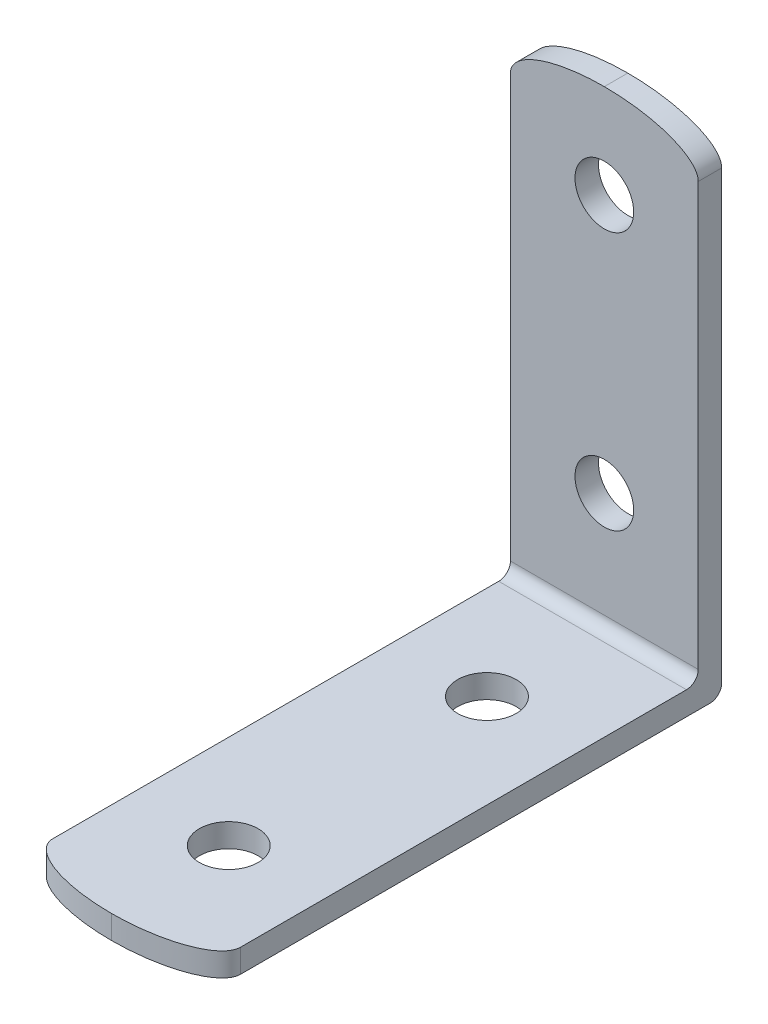
ISO-10303-21;
HEADER;
FILE_DESCRIPTION(('STEP AP214'),'2;1');
FILE_NAME('part.step','',(''),(''),'','','');
FILE_SCHEMA(('AUTOMOTIVE_DESIGN { 1 0 10303 214 1 1 1 1 }'));
ENDSEC;
DATA;
#1=APPLICATION_CONTEXT('core data for automotive mechanical design processes');
#2=APPLICATION_PROTOCOL_DEFINITION('international standard','automotive_design',2000,#1);
#3=PRODUCT_CONTEXT('',#1,'mechanical');
#4=PRODUCT('Part','Part','',(#3));
#5=PRODUCT_RELATED_PRODUCT_CATEGORY('part','',(#4));
#6=PRODUCT_DEFINITION_FORMATION('','',#4);
#7=PRODUCT_DEFINITION_CONTEXT('part definition',#1,'design');
#8=PRODUCT_DEFINITION('design','',#6,#7);
#9=PRODUCT_DEFINITION_SHAPE('','',#8);
#10=(LENGTH_UNIT() NAMED_UNIT(*) SI_UNIT(.MILLI.,.METRE.));
#11=(NAMED_UNIT(*) PLANE_ANGLE_UNIT() SI_UNIT($,.RADIAN.));
#12=(NAMED_UNIT(*) SI_UNIT($,.STERADIAN.) SOLID_ANGLE_UNIT());
#13=UNCERTAINTY_MEASURE_WITH_UNIT(LENGTH_MEASURE(1.E-05),#10,'distance_accuracy_value','');
#14=(GEOMETRIC_REPRESENTATION_CONTEXT(3) GLOBAL_UNCERTAINTY_ASSIGNED_CONTEXT((#13)) GLOBAL_UNIT_ASSIGNED_CONTEXT((#10,
#11,#12)) REPRESENTATION_CONTEXT('',''));
#15=CARTESIAN_POINT('',(0.,0.,0.));
#16=DIRECTION('',(0.,0.,1.));
#17=DIRECTION('',(1.,0.,0.));
#18=AXIS2_PLACEMENT_3D('',#15,#16,#17);
#19=CARTESIAN_POINT('',(0.,0.,2.));
#20=DIRECTION('',(0.,0.,1.));
#21=DIRECTION('',(1.,0.,0.));
#22=AXIS2_PLACEMENT_3D('',#19,#20,#21);
#23=PLANE('',#22);
#24=CARTESIAN_POINT('',(0.,12.,2.));
#25=DIRECTION('',(0.,0.,1.));
#26=DIRECTION('',(1.,0.,0.));
#27=AXIS2_PLACEMENT_3D('',#24,#25,#26);
#28=CIRCLE('',#27,2.5);
#29=CARTESIAN_POINT('',(2.5,12.,2.));
#30=VERTEX_POINT('',#29);
#31=EDGE_CURVE('E181',#30,#30,#28,.T.);
#32=ORIENTED_EDGE('',*,*,#31,.F.);
#33=EDGE_LOOP('',(#32));
#34=FACE_BOUND('',#33,.T.);
#35=CARTESIAN_POINT('',(0.,34.,2.));
#36=DIRECTION('',(0.,0.,1.));
#37=DIRECTION('',(1.,0.,0.));
#38=AXIS2_PLACEMENT_3D('',#35,#36,#37);
#39=CIRCLE('',#38,2.5);
#40=CARTESIAN_POINT('',(2.5,34.,2.));
#41=VERTEX_POINT('',#40);
#42=EDGE_CURVE('E556',#41,#41,#39,.T.);
#43=ORIENTED_EDGE('',*,*,#42,.F.);
#44=EDGE_LOOP('',(#43));
#45=FACE_BOUND('',#44,.T.);
#46=CARTESIAN_POINT('',(0.,42.,2.));
#47=CARTESIAN_POINT('',(8.,42.,2.));
#48=CARTESIAN_POINT('',(8.,39.,2.));
#49=(BOUNDED_CURVE() B_SPLINE_CURVE(2,(#46,#47,#48),.UNSPECIFIED.,.F.,
.F.) B_SPLINE_CURVE_WITH_KNOTS((3,3),(0.,1.),
.UNSPECIFIED.) CURVE() GEOMETRIC_REPRESENTATION_ITEM() RATIONAL_B_SPLINE_CURVE((1.,
0.707106781186548,1.)) REPRESENTATION_ITEM(''));
#50=CARTESIAN_POINT('',(8.,39.,2.));
#51=VERTEX_POINT('',#50);
#52=CARTESIAN_POINT('',(0.,42.,2.));
#53=VERTEX_POINT('',#52);
#54=EDGE_CURVE('E470',#51,#53,#49,.F.);
#55=ORIENTED_EDGE('',*,*,#54,.T.);
#56=CARTESIAN_POINT('',(-8.00000000000001,39.,2.));
#57=CARTESIAN_POINT('',(-8.00000000000001,42.,2.));
#58=CARTESIAN_POINT('',(0.,42.,2.));
#59=(BOUNDED_CURVE() B_SPLINE_CURVE(2,(#56,#57,#58),.UNSPECIFIED.,.F.,
.F.) B_SPLINE_CURVE_WITH_KNOTS((3,3),(0.,1.),
.UNSPECIFIED.) CURVE() GEOMETRIC_REPRESENTATION_ITEM() RATIONAL_B_SPLINE_CURVE((1.,
0.707106781186548,1.)) REPRESENTATION_ITEM(''));
#60=CARTESIAN_POINT('',(-8.00000000000001,39.,2.));
#61=VERTEX_POINT('',#60);
#62=EDGE_CURVE('E13',#53,#61,#59,.F.);
#63=ORIENTED_EDGE('',*,*,#62,.T.);
#64=DIRECTION('',(0.,-1.,0.));
#65=VECTOR('',#64,1.);
#66=CARTESIAN_POINT('',(-8.00000000000001,42.,2.));
#67=LINE('',#66,#65);
#68=CARTESIAN_POINT('',(-8.,3.00000000000001,2.));
#69=VERTEX_POINT('',#68);
#70=EDGE_CURVE('E131',#61,#69,#67,.T.);
#71=ORIENTED_EDGE('',*,*,#70,.T.);
#72=DIRECTION('',(1.,0.,0.));
#73=VECTOR('',#72,1.);
#74=CARTESIAN_POINT('',(8.,3.,2.));
#75=LINE('',#74,#73);
#76=CARTESIAN_POINT('',(8.,3.,2.));
#77=VERTEX_POINT('',#76);
#78=EDGE_CURVE('E135',#69,#77,#75,.T.);
#79=ORIENTED_EDGE('',*,*,#78,.T.);
#80=DIRECTION('',(0.,1.,0.));
#81=VECTOR('',#80,1.);
#82=CARTESIAN_POINT('',(8.,0.,2.));
#83=LINE('',#82,#81);
#84=EDGE_CURVE('E139',#77,#51,#83,.T.);
#85=ORIENTED_EDGE('',*,*,#84,.T.);
#86=EDGE_LOOP('',(#55,#63,#71,#79,#85));
#87=FACE_BOUND('',#86,.T.);
#88=ADVANCED_FACE('F50',(#34,#45,#87),#23,.T.);
#89=CARTESIAN_POINT('',(0.,0.,0.));
#90=DIRECTION('',(0.,0.,1.));
#91=DIRECTION('',(1.,0.,0.));
#92=AXIS2_PLACEMENT_3D('',#89,#90,#91);
#93=PLANE('',#92);
#94=DIRECTION('',(0.,-1.,0.));
#95=VECTOR('',#94,1.);
#96=CARTESIAN_POINT('',(-8.00000000000001,42.,0.));
#97=LINE('',#96,#95);
#98=CARTESIAN_POINT('',(-8.00000000000001,39.,0.));
#99=VERTEX_POINT('',#98);
#100=CARTESIAN_POINT('',(-8.,1.00000000000001,0.));
#101=VERTEX_POINT('',#100);
#102=EDGE_CURVE('E180',#99,#101,#97,.T.);
#103=ORIENTED_EDGE('',*,*,#102,.F.);
#104=CARTESIAN_POINT('',(0.,42.,0.));
#105=CARTESIAN_POINT('',(-8.00000000000001,42.,0.));
#106=CARTESIAN_POINT('',(-8.00000000000001,39.,0.));
#107=(BOUNDED_CURVE() B_SPLINE_CURVE(2,(#104,#105,#106),.UNSPECIFIED.,.F.,
.F.) B_SPLINE_CURVE_WITH_KNOTS((3,3),(0.,1.),
.UNSPECIFIED.) CURVE() GEOMETRIC_REPRESENTATION_ITEM() RATIONAL_B_SPLINE_CURVE((1.,
0.707106781186548,1.)) REPRESENTATION_ITEM(''));
#108=CARTESIAN_POINT('',(0.,42.,0.));
#109=VERTEX_POINT('',#108);
#110=EDGE_CURVE('E64',#99,#109,#107,.F.);
#111=ORIENTED_EDGE('',*,*,#110,.T.);
#112=CARTESIAN_POINT('',(8.,39.,0.));
#113=CARTESIAN_POINT('',(8.,42.,0.));
#114=CARTESIAN_POINT('',(0.,42.,0.));
#115=(BOUNDED_CURVE() B_SPLINE_CURVE(2,(#112,#113,#114),.UNSPECIFIED.,.F.,
.F.) B_SPLINE_CURVE_WITH_KNOTS((3,3),(0.,1.),
.UNSPECIFIED.) CURVE() GEOMETRIC_REPRESENTATION_ITEM() RATIONAL_B_SPLINE_CURVE((1.,
0.707106781186548,1.)) REPRESENTATION_ITEM(''));
#116=CARTESIAN_POINT('',(8.,39.,0.));
#117=VERTEX_POINT('',#116);
#118=EDGE_CURVE('E268',#109,#117,#115,.F.);
#119=ORIENTED_EDGE('',*,*,#118,.T.);
#120=DIRECTION('',(0.,1.,0.));
#121=VECTOR('',#120,1.);
#122=CARTESIAN_POINT('',(8.,0.,0.));
#123=LINE('',#122,#121);
#124=CARTESIAN_POINT('',(8.,1.,0.));
#125=VERTEX_POINT('',#124);
#126=EDGE_CURVE('E176',#125,#117,#123,.T.);
#127=ORIENTED_EDGE('',*,*,#126,.F.);
#128=DIRECTION('',(1.,0.,0.));
#129=VECTOR('',#128,1.);
#130=CARTESIAN_POINT('',(0.,1.,0.));
#131=LINE('',#130,#129);
#132=EDGE_CURVE('E169',#125,#101,#131,.F.);
#133=ORIENTED_EDGE('',*,*,#132,.T.);
#134=EDGE_LOOP('',(#103,#111,#119,#127,#133));
#135=FACE_BOUND('',#134,.T.);
#136=CARTESIAN_POINT('',(0.,12.,0.));
#137=DIRECTION('',(0.,0.,1.));
#138=DIRECTION('',(1.,0.,0.));
#139=AXIS2_PLACEMENT_3D('',#136,#137,#138);
#140=CIRCLE('',#139,2.5);
#141=CARTESIAN_POINT('',(2.5,12.,0.));
#142=VERTEX_POINT('',#141);
#143=EDGE_CURVE('E559',#142,#142,#140,.T.);
#144=ORIENTED_EDGE('',*,*,#143,.T.);
#145=EDGE_LOOP('',(#144));
#146=FACE_BOUND('',#145,.T.);
#147=CARTESIAN_POINT('',(0.,34.,0.));
#148=DIRECTION('',(0.,0.,1.));
#149=DIRECTION('',(1.,0.,0.));
#150=AXIS2_PLACEMENT_3D('',#147,#148,#149);
#151=CIRCLE('',#150,2.5);
#152=CARTESIAN_POINT('',(2.5,34.,0.));
#153=VERTEX_POINT('',#152);
#154=EDGE_CURVE('E549',#153,#153,#151,.T.);
#155=ORIENTED_EDGE('',*,*,#154,.T.);
#156=EDGE_LOOP('',(#155));
#157=FACE_BOUND('',#156,.T.);
#158=ADVANCED_FACE('F212',(#135,#146,#157),#93,.F.);
#159=CARTESIAN_POINT('',(0.,0.,2.));
#160=DIRECTION('',(0.,1.,0.));
#161=DIRECTION('',(0.,0.,1.));
#162=AXIS2_PLACEMENT_3D('',#159,#160,#161);
#163=PLANE('',#162);
#164=CARTESIAN_POINT('',(0.,0.,12.));
#165=DIRECTION('',(0.,-1.,0.));
#166=DIRECTION('',(0.,0.,-1.));
#167=AXIS2_PLACEMENT_3D('',#164,#165,#166);
#168=CIRCLE('',#167,2.5);
#169=CARTESIAN_POINT('',(0.,0.,9.5));
#170=VERTEX_POINT('',#169);
#171=EDGE_CURVE('E568',#170,#170,#168,.T.);
#172=ORIENTED_EDGE('',*,*,#171,.F.);
#173=EDGE_LOOP('',(#172));
#174=FACE_BOUND('',#173,.T.);
#175=CARTESIAN_POINT('',(0.,0.,34.));
#176=DIRECTION('',(0.,-1.,0.));
#177=DIRECTION('',(0.,0.,-1.));
#178=AXIS2_PLACEMENT_3D('',#175,#176,#177);
#179=CIRCLE('',#178,2.5);
#180=CARTESIAN_POINT('',(0.,0.,31.5));
#181=VERTEX_POINT('',#180);
#182=EDGE_CURVE('E590',#181,#181,#179,.T.);
#183=ORIENTED_EDGE('',*,*,#182,.F.);
#184=EDGE_LOOP('',(#183));
#185=FACE_BOUND('',#184,.T.);
#186=CARTESIAN_POINT('',(0.,0.,44.));
#187=CARTESIAN_POINT('',(8.,0.,44.));
#188=CARTESIAN_POINT('',(8.,0.,41.));
#189=(BOUNDED_CURVE() B_SPLINE_CURVE(2,(#186,#187,#188),.UNSPECIFIED.,.F.,
.F.) B_SPLINE_CURVE_WITH_KNOTS((3,3),(0.,1.),
.UNSPECIFIED.) CURVE() GEOMETRIC_REPRESENTATION_ITEM() RATIONAL_B_SPLINE_CURVE((1.,
0.707106781186548,1.)) REPRESENTATION_ITEM(''));
#190=CARTESIAN_POINT('',(8.,0.,41.));
#191=VERTEX_POINT('',#190);
#192=CARTESIAN_POINT('',(0.,0.,44.));
#193=VERTEX_POINT('',#192);
#194=EDGE_CURVE('E467',#191,#193,#189,.F.);
#195=ORIENTED_EDGE('',*,*,#194,.T.);
#196=CARTESIAN_POINT('',(-8.,0.,41.));
#197=CARTESIAN_POINT('',(-8.,0.,44.));
#198=CARTESIAN_POINT('',(0.,0.,44.));
#199=(BOUNDED_CURVE() B_SPLINE_CURVE(2,(#196,#197,#198),.UNSPECIFIED.,.F.,
.F.) B_SPLINE_CURVE_WITH_KNOTS((3,3),(0.,1.),
.UNSPECIFIED.) CURVE() GEOMETRIC_REPRESENTATION_ITEM() RATIONAL_B_SPLINE_CURVE((1.,
0.707106781186548,1.)) REPRESENTATION_ITEM(''));
#200=CARTESIAN_POINT('',(-8.,0.,41.));
#201=VERTEX_POINT('',#200);
#202=EDGE_CURVE('E335',#193,#201,#199,.F.);
#203=ORIENTED_EDGE('',*,*,#202,.T.);
#204=DIRECTION('',(0.,0.,-1.));
#205=VECTOR('',#204,1.);
#206=CARTESIAN_POINT('',(-8.,0.,2.));
#207=LINE('',#206,#205);
#208=CARTESIAN_POINT('',(-8.,0.,1.));
#209=VERTEX_POINT('',#208);
#210=EDGE_CURVE('E138',#201,#209,#207,.T.);
#211=ORIENTED_EDGE('',*,*,#210,.T.);
#212=DIRECTION('',(1.,0.,0.));
#213=VECTOR('',#212,1.);
#214=CARTESIAN_POINT('',(0.,0.,1.));
#215=LINE('',#214,#213);
#216=CARTESIAN_POINT('',(8.,0.,1.));
#217=VERTEX_POINT('',#216);
#218=EDGE_CURVE('E158',#209,#217,#215,.T.);
#219=ORIENTED_EDGE('',*,*,#218,.T.);
#220=DIRECTION('',(0.,0.,-1.));
#221=VECTOR('',#220,1.);
#222=CARTESIAN_POINT('',(8.,0.,2.));
#223=LINE('',#222,#221);
#224=EDGE_CURVE('E156',#191,#217,#223,.T.);
#225=ORIENTED_EDGE('',*,*,#224,.F.);
#226=EDGE_LOOP('',(#195,#203,#211,#219,#225));
#227=FACE_BOUND('',#226,.T.);
#228=ADVANCED_FACE('F531',(#174,#185,#227),#163,.F.);
#229=CARTESIAN_POINT('',(8.,0.,2.));
#230=DIRECTION('',(-1.,0.,0.));
#231=DIRECTION('',(0.,0.,1.));
#232=AXIS2_PLACEMENT_3D('',#229,#230,#231);
#233=PLANE('',#232);
#234=ORIENTED_EDGE('',*,*,#126,.T.);
#235=CARTESIAN_POINT('',(8.,39.,2.1));
#236=CARTESIAN_POINT('',(8.,39.,1.36666666666667));
#237=CARTESIAN_POINT('',(8.,39.,0.633333333333333));
#238=CARTESIAN_POINT('',(8.,39.,-0.1));
#239=(BOUNDED_CURVE() B_SPLINE_CURVE(3,(#235,#236,#237,#238),.UNSPECIFIED.,.F.,
.F.) B_SPLINE_CURVE_WITH_KNOTS((4,4),(-0.0001,0.0021),
.UNSPECIFIED.) CURVE() GEOMETRIC_REPRESENTATION_ITEM() RATIONAL_B_SPLINE_CURVE((1.,1.,1.,1.)) REPRESENTATION_ITEM(''));
#240=EDGE_CURVE('E321',#117,#51,#239,.F.);
#241=ORIENTED_EDGE('',*,*,#240,.T.);
#242=ORIENTED_EDGE('',*,*,#84,.F.);
#243=CARTESIAN_POINT('',(8.,3.,3.));
#244=DIRECTION('',(-1.,0.,0.));
#245=DIRECTION('',(0.,0.,1.));
#246=AXIS2_PLACEMENT_3D('',#243,#244,#245);
#247=CIRCLE('',#246,1.);
#248=CARTESIAN_POINT('',(8.,2.,3.00000000000002));
#249=VERTEX_POINT('',#248);
#250=EDGE_CURVE('E151',#77,#249,#247,.T.);
#251=ORIENTED_EDGE('',*,*,#250,.T.);
#252=DIRECTION('',(0.,0.,-1.));
#253=VECTOR('',#252,1.);
#254=CARTESIAN_POINT('',(8.,2.,44.));
#255=LINE('',#254,#253);
#256=CARTESIAN_POINT('',(8.,2.,41.));
#257=VERTEX_POINT('',#256);
#258=EDGE_CURVE('E550',#257,#249,#255,.T.);
#259=ORIENTED_EDGE('',*,*,#258,.F.);
#260=CARTESIAN_POINT('',(8.,-0.1,41.));
#261=CARTESIAN_POINT('',(8.,0.633333333333334,41.));
#262=CARTESIAN_POINT('',(8.,1.36666666666666,41.));
#263=CARTESIAN_POINT('',(8.,2.1,41.));
#264=(BOUNDED_CURVE() B_SPLINE_CURVE(3,(#260,#261,#262,#263),.UNSPECIFIED.,.F.,
.F.) B_SPLINE_CURVE_WITH_KNOTS((4,4),(-0.0021,9.99999999999998E-05),
.UNSPECIFIED.) CURVE() GEOMETRIC_REPRESENTATION_ITEM() RATIONAL_B_SPLINE_CURVE((1.,1.,1.,1.)) REPRESENTATION_ITEM(''));
#265=EDGE_CURVE('E463',#257,#191,#264,.F.);
#266=ORIENTED_EDGE('',*,*,#265,.T.);
#267=ORIENTED_EDGE('',*,*,#224,.T.);
#268=CARTESIAN_POINT('',(8.,1.,1.));
#269=DIRECTION('',(-1.,0.,0.));
#270=DIRECTION('',(0.,0.,1.));
#271=AXIS2_PLACEMENT_3D('',#268,#269,#270);
#272=CIRCLE('',#271,1.);
#273=EDGE_CURVE('E167',#217,#125,#272,.F.);
#274=ORIENTED_EDGE('',*,*,#273,.T.);
#275=EDGE_LOOP('',(#234,#241,#242,#251,#259,#266,#267,#274));
#276=FACE_BOUND('',#275,.T.);
#277=ADVANCED_FACE('F211',(#276),#233,.F.);
#278=CARTESIAN_POINT('',(-8.00000000000001,42.,2.));
#279=DIRECTION('',(1.,0.,0.));
#280=DIRECTION('',(0.,1.,0.));
#281=AXIS2_PLACEMENT_3D('',#278,#279,#280);
#282=PLANE('',#281);
#283=ORIENTED_EDGE('',*,*,#70,.F.);
#284=CARTESIAN_POINT('',(-8.00000000000001,39.,-0.1));
#285=CARTESIAN_POINT('',(-8.00000000000001,39.,0.633333333333333));
#286=CARTESIAN_POINT('',(-8.00000000000001,39.,1.36666666666667));
#287=CARTESIAN_POINT('',(-8.00000000000001,39.,2.1));
#288=(BOUNDED_CURVE() B_SPLINE_CURVE(3,(#284,#285,#286,#287),.UNSPECIFIED.,.F.,
.F.) B_SPLINE_CURVE_WITH_KNOTS((4,4),(-9.99999999999998E-05,0.0021),
.UNSPECIFIED.) CURVE() GEOMETRIC_REPRESENTATION_ITEM() RATIONAL_B_SPLINE_CURVE((1.,1.,1.,1.)) REPRESENTATION_ITEM(''));
#289=EDGE_CURVE('E194',#61,#99,#288,.F.);
#290=ORIENTED_EDGE('',*,*,#289,.T.);
#291=ORIENTED_EDGE('',*,*,#102,.T.);
#292=CARTESIAN_POINT('',(-8.,1.,1.));
#293=DIRECTION('',(1.,0.,0.));
#294=DIRECTION('',(0.,1.,0.));
#295=AXIS2_PLACEMENT_3D('',#292,#293,#294);
#296=CIRCLE('',#295,1.);
#297=EDGE_CURVE('E172',#101,#209,#296,.F.);
#298=ORIENTED_EDGE('',*,*,#297,.T.);
#299=ORIENTED_EDGE('',*,*,#210,.F.);
#300=CARTESIAN_POINT('',(-8.,2.1,41.));
#301=CARTESIAN_POINT('',(-8.,1.36666666666666,41.));
#302=CARTESIAN_POINT('',(-8.,0.633333333333332,41.));
#303=CARTESIAN_POINT('',(-8.,-0.100000000000001,41.));
#304=(BOUNDED_CURVE() B_SPLINE_CURVE(3,(#300,#301,#302,#303),.UNSPECIFIED.,.F.,
.F.) B_SPLINE_CURVE_WITH_KNOTS((4,4),(-9.99999999999998E-05,0.0021),
.UNSPECIFIED.) CURVE() GEOMETRIC_REPRESENTATION_ITEM() RATIONAL_B_SPLINE_CURVE((1.,1.,1.,1.)) REPRESENTATION_ITEM(''));
#305=CARTESIAN_POINT('',(-8.,2.,41.));
#306=VERTEX_POINT('',#305);
#307=EDGE_CURVE('E465',#201,#306,#304,.F.);
#308=ORIENTED_EDGE('',*,*,#307,.T.);
#309=DIRECTION('',(0.,0.,-1.));
#310=VECTOR('',#309,1.);
#311=CARTESIAN_POINT('',(-8.,2.,44.));
#312=LINE('',#311,#310);
#313=CARTESIAN_POINT('',(-8.,2.,3.00000000000002));
#314=VERTEX_POINT('',#313);
#315=EDGE_CURVE('E146',#306,#314,#312,.T.);
#316=ORIENTED_EDGE('',*,*,#315,.T.);
#317=CARTESIAN_POINT('',(-8.,3.,3.));
#318=DIRECTION('',(1.,0.,0.));
#319=DIRECTION('',(0.,1.,0.));
#320=AXIS2_PLACEMENT_3D('',#317,#318,#319);
#321=CIRCLE('',#320,1.);
#322=EDGE_CURVE('E142',#314,#69,#321,.T.);
#323=ORIENTED_EDGE('',*,*,#322,.T.);
#324=EDGE_LOOP('',(#283,#290,#291,#298,#299,#308,#316,#323));
#325=FACE_BOUND('',#324,.T.);
#326=ADVANCED_FACE('F143',(#325),#282,.F.);
#327=CARTESIAN_POINT('',(0.,12.,2.));
#328=DIRECTION('',(0.,0.,-1.));
#329=DIRECTION('',(-1.,0.,0.));
#330=AXIS2_PLACEMENT_3D('',#327,#328,#329);
#331=CYLINDRICAL_SURFACE('',#330,2.5);
#332=ORIENTED_EDGE('',*,*,#31,.T.);
#333=EDGE_LOOP('',(#332));
#334=FACE_BOUND('',#333,.T.);
#335=ORIENTED_EDGE('',*,*,#143,.F.);
#336=EDGE_LOOP('',(#335));
#337=FACE_BOUND('',#336,.T.);
#338=ADVANCED_FACE('F210',(#334,#337),#331,.F.);
#339=CARTESIAN_POINT('',(0.,34.,2.));
#340=DIRECTION('',(0.,0.,-1.));
#341=DIRECTION('',(-1.,0.,0.));
#342=AXIS2_PLACEMENT_3D('',#339,#340,#341);
#343=CYLINDRICAL_SURFACE('',#342,2.5);
#344=ORIENTED_EDGE('',*,*,#42,.T.);
#345=EDGE_LOOP('',(#344));
#346=FACE_BOUND('',#345,.T.);
#347=ORIENTED_EDGE('',*,*,#154,.F.);
#348=EDGE_LOOP('',(#347));
#349=FACE_BOUND('',#348,.T.);
#350=ADVANCED_FACE('F249',(#346,#349),#343,.F.);
#351=CARTESIAN_POINT('',(0.,2.,44.));
#352=DIRECTION('',(0.,1.,0.));
#353=DIRECTION('',(0.,0.,1.));
#354=AXIS2_PLACEMENT_3D('',#351,#352,#353);
#355=PLANE('',#354);
#356=CARTESIAN_POINT('',(0.,2.,12.));
#357=DIRECTION('',(0.,1.,0.));
#358=DIRECTION('',(0.,0.,1.));
#359=AXIS2_PLACEMENT_3D('',#356,#357,#358);
#360=CIRCLE('',#359,2.5);
#361=CARTESIAN_POINT('',(0.,2.,14.5));
#362=VERTEX_POINT('',#361);
#363=EDGE_CURVE('E585',#362,#362,#360,.F.);
#364=ORIENTED_EDGE('',*,*,#363,.T.);
#365=EDGE_LOOP('',(#364));
#366=FACE_BOUND('',#365,.T.);
#367=CARTESIAN_POINT('',(0.,2.,34.));
#368=DIRECTION('',(0.,1.,0.));
#369=DIRECTION('',(0.,0.,1.));
#370=AXIS2_PLACEMENT_3D('',#367,#368,#369);
#371=CIRCLE('',#370,2.5);
#372=CARTESIAN_POINT('',(0.,2.,36.5));
#373=VERTEX_POINT('',#372);
#374=EDGE_CURVE('E594',#373,#373,#371,.F.);
#375=ORIENTED_EDGE('',*,*,#374,.T.);
#376=EDGE_LOOP('',(#375));
#377=FACE_BOUND('',#376,.T.);
#378=ORIENTED_EDGE('',*,*,#315,.F.);
#379=CARTESIAN_POINT('',(0.,2.,44.));
#380=CARTESIAN_POINT('',(-8.,2.,44.));
#381=CARTESIAN_POINT('',(-8.,2.,41.));
#382=(BOUNDED_CURVE() B_SPLINE_CURVE(2,(#379,#380,#381),.UNSPECIFIED.,.F.,
.F.) B_SPLINE_CURVE_WITH_KNOTS((3,3),(0.,1.),
.UNSPECIFIED.) CURVE() GEOMETRIC_REPRESENTATION_ITEM() RATIONAL_B_SPLINE_CURVE((1.,
0.707106781186548,1.)) REPRESENTATION_ITEM(''));
#383=CARTESIAN_POINT('',(0.,2.,44.));
#384=VERTEX_POINT('',#383);
#385=EDGE_CURVE('E464',#306,#384,#382,.F.);
#386=ORIENTED_EDGE('',*,*,#385,.T.);
#387=CARTESIAN_POINT('',(8.,2.,41.));
#388=CARTESIAN_POINT('',(8.,2.,44.));
#389=CARTESIAN_POINT('',(0.,2.,44.));
#390=(BOUNDED_CURVE() B_SPLINE_CURVE(2,(#387,#388,#389),.UNSPECIFIED.,.F.,
.F.) B_SPLINE_CURVE_WITH_KNOTS((3,3),(0.,1.),
.UNSPECIFIED.) CURVE() GEOMETRIC_REPRESENTATION_ITEM() RATIONAL_B_SPLINE_CURVE((1.,
0.707106781186548,1.)) REPRESENTATION_ITEM(''));
#391=EDGE_CURVE('E232',#384,#257,#390,.F.);
#392=ORIENTED_EDGE('',*,*,#391,.T.);
#393=ORIENTED_EDGE('',*,*,#258,.T.);
#394=DIRECTION('',(1.,0.,0.));
#395=VECTOR('',#394,1.);
#396=CARTESIAN_POINT('',(-8.,2.,3.));
#397=LINE('',#396,#395);
#398=EDGE_CURVE('E155',#249,#314,#397,.F.);
#399=ORIENTED_EDGE('',*,*,#398,.T.);
#400=EDGE_LOOP('',(#378,#386,#392,#393,#399));
#401=FACE_BOUND('',#400,.T.);
#402=ADVANCED_FACE('F239',(#366,#377,#401),#355,.T.);
#403=CARTESIAN_POINT('',(0.,3.,3.));
#404=DIRECTION('',(-1.,0.,0.));
#405=DIRECTION('',(0.,0.,1.));
#406=AXIS2_PLACEMENT_3D('',#403,#404,#405);
#407=CYLINDRICAL_SURFACE('',#406,1.);
#408=ORIENTED_EDGE('',*,*,#322,.F.);
#409=ORIENTED_EDGE('',*,*,#398,.F.);
#410=ORIENTED_EDGE('',*,*,#250,.F.);
#411=ORIENTED_EDGE('',*,*,#78,.F.);
#412=EDGE_LOOP('',(#408,#409,#410,#411));
#413=FACE_BOUND('',#412,.T.);
#414=ADVANCED_FACE('F153',(#413),#407,.F.);
#415=CARTESIAN_POINT('',(0.,1.,1.));
#416=DIRECTION('',(1.,0.,0.));
#417=DIRECTION('',(0.,0.,-1.));
#418=AXIS2_PLACEMENT_3D('',#415,#416,#417);
#419=CYLINDRICAL_SURFACE('',#418,1.);
#420=ORIENTED_EDGE('',*,*,#297,.F.);
#421=ORIENTED_EDGE('',*,*,#132,.F.);
#422=ORIENTED_EDGE('',*,*,#273,.F.);
#423=ORIENTED_EDGE('',*,*,#218,.F.);
#424=EDGE_LOOP('',(#420,#421,#422,#423));
#425=FACE_BOUND('',#424,.T.);
#426=ADVANCED_FACE('F292',(#425),#419,.T.);
#427=CARTESIAN_POINT('',(0.,42.001,34.));
#428=DIRECTION('',(0.,-1.,0.));
#429=DIRECTION('',(0.,0.,-1.));
#430=AXIS2_PLACEMENT_3D('',#427,#428,#429);
#431=CYLINDRICAL_SURFACE('',#430,2.5);
#432=ORIENTED_EDGE('',*,*,#374,.F.);
#433=EDGE_LOOP('',(#432));
#434=FACE_BOUND('',#433,.T.);
#435=ORIENTED_EDGE('',*,*,#182,.T.);
#436=EDGE_LOOP('',(#435));
#437=FACE_BOUND('',#436,.T.);
#438=ADVANCED_FACE('F251',(#434,#437),#431,.F.);
#439=CARTESIAN_POINT('',(0.,42.001,12.));
#440=DIRECTION('',(0.,-1.,0.));
#441=DIRECTION('',(0.,0.,-1.));
#442=AXIS2_PLACEMENT_3D('',#439,#440,#441);
#443=CYLINDRICAL_SURFACE('',#442,2.5);
#444=ORIENTED_EDGE('',*,*,#363,.F.);
#445=EDGE_LOOP('',(#444));
#446=FACE_BOUND('',#445,.T.);
#447=ORIENTED_EDGE('',*,*,#171,.T.);
#448=EDGE_LOOP('',(#447));
#449=FACE_BOUND('',#448,.T.);
#450=ADVANCED_FACE('F291',(#446,#449),#443,.F.);
#451=CARTESIAN_POINT('',(0.,42.,2.1));
#452=CARTESIAN_POINT('',(0.,42.,1.36666666666667));
#453=CARTESIAN_POINT('',(0.,42.,0.633333333333333));
#454=CARTESIAN_POINT('',(0.,42.,-0.1));
#455=CARTESIAN_POINT('',(8.,42.,2.1));
#456=CARTESIAN_POINT('',(8.,42.,1.36666666666667));
#457=CARTESIAN_POINT('',(8.,42.,0.633333333333333));
#458=CARTESIAN_POINT('',(8.,42.,-0.1));
#459=CARTESIAN_POINT('',(8.,39.,2.1));
#460=CARTESIAN_POINT('',(8.,39.,1.36666666666667));
#461=CARTESIAN_POINT('',(8.,39.,0.633333333333333));
#462=CARTESIAN_POINT('',(8.,39.,-0.1));
#463=(BOUNDED_SURFACE() B_SPLINE_SURFACE(2,3,((#451,#452,#453,#454),(#455,#456,#457,#458),(#459,
#460,#461,#462)),.UNSPECIFIED.,.F.,.F.,.F.) B_SPLINE_SURFACE_WITH_KNOTS((3,3),(4,4),(0.,1.),
(-0.0001,0.0021),.UNSPECIFIED.) GEOMETRIC_REPRESENTATION_ITEM() RATIONAL_B_SPLINE_SURFACE(((1.,
1.,1.,1.),(0.707106781186548,0.707106781186548,0.707106781186548,0.707106781186548),(1.,1.,1.,1.))) REPRESENTATION_ITEM('') SURFACE());
#464=CARTESIAN_POINT('',(0.,42.,2.1));
#465=CARTESIAN_POINT('',(0.,42.,1.36666666666667));
#466=CARTESIAN_POINT('',(0.,42.,0.633333333333333));
#467=CARTESIAN_POINT('',(0.,42.,-0.1));
#468=(BOUNDED_CURVE() B_SPLINE_CURVE(3,(#464,#465,#466,#467),.UNSPECIFIED.,.F.,
.F.) B_SPLINE_CURVE_WITH_KNOTS((4,4),(-0.0001,0.0021),
.UNSPECIFIED.) CURVE() GEOMETRIC_REPRESENTATION_ITEM() RATIONAL_B_SPLINE_CURVE((1.,1.,1.,1.)) REPRESENTATION_ITEM(''));
#469=EDGE_CURVE('E150',#53,#109,#468,.T.);
#470=ORIENTED_EDGE('',*,*,#54,.F.);
#471=ORIENTED_EDGE('',*,*,#240,.F.);
#472=ORIENTED_EDGE('',*,*,#118,.F.);
#473=ORIENTED_EDGE('',*,*,#469,.F.);
#474=EDGE_LOOP('',(#470,#471,#472,#473));
#475=FACE_BOUND('',#474,.T.);
#476=ADVANCED_FACE('F275',(#475),#463,.T.);
#477=CARTESIAN_POINT('',(8.,2.1,41.));
#478=CARTESIAN_POINT('',(8.,1.36666666666666,41.));
#479=CARTESIAN_POINT('',(8.,0.633333333333334,41.));
#480=CARTESIAN_POINT('',(8.,-0.1,41.));
#481=CARTESIAN_POINT('',(8.,2.1,44.));
#482=CARTESIAN_POINT('',(8.,1.36666666666667,44.));
#483=CARTESIAN_POINT('',(8.,0.633333333333333,44.));
#484=CARTESIAN_POINT('',(8.,-0.1,44.));
#485=CARTESIAN_POINT('',(0.,2.1,44.));
#486=CARTESIAN_POINT('',(0.,1.36666666666666,44.));
#487=CARTESIAN_POINT('',(0.,0.633333333333334,44.));
#488=CARTESIAN_POINT('',(0.,-0.1,44.));
#489=(BOUNDED_SURFACE() B_SPLINE_SURFACE(2,3,((#477,#478,#479,#480),(#481,#482,#483,#484),(#485,
#486,#487,#488)),.UNSPECIFIED.,.F.,.F.,.F.) B_SPLINE_SURFACE_WITH_KNOTS((3,3),(4,4),(0.,1.),
(-0.0021,9.99999999999999E-05),
.UNSPECIFIED.) GEOMETRIC_REPRESENTATION_ITEM() RATIONAL_B_SPLINE_SURFACE(((1.,1.,1.,1.),
(0.707106781186548,0.707106781186548,0.707106781186548,0.707106781186548),(1.,1.,1.,1.))) REPRESENTATION_ITEM('') SURFACE());
#490=CARTESIAN_POINT('',(0.,-0.1,44.));
#491=CARTESIAN_POINT('',(0.,0.633333333333333,44.));
#492=CARTESIAN_POINT('',(0.,1.36666666666667,44.));
#493=CARTESIAN_POINT('',(0.,2.1,44.));
#494=(BOUNDED_CURVE() B_SPLINE_CURVE(3,(#490,#491,#492,#493),.UNSPECIFIED.,.F.,
.F.) B_SPLINE_CURVE_WITH_KNOTS((4,4),(-0.0001,0.0021),
.UNSPECIFIED.) CURVE() GEOMETRIC_REPRESENTATION_ITEM() RATIONAL_B_SPLINE_CURVE((1.,1.,1.,1.)) REPRESENTATION_ITEM(''));
#495=EDGE_CURVE('E346',#193,#384,#494,.T.);
#496=ORIENTED_EDGE('',*,*,#265,.F.);
#497=ORIENTED_EDGE('',*,*,#391,.F.);
#498=ORIENTED_EDGE('',*,*,#495,.F.);
#499=ORIENTED_EDGE('',*,*,#194,.F.);
#500=EDGE_LOOP('',(#496,#497,#498,#499));
#501=FACE_BOUND('',#500,.T.);
#502=ADVANCED_FACE('F290',(#501),#489,.T.);
#503=CARTESIAN_POINT('',(-8.,-0.100000000000001,41.));
#504=CARTESIAN_POINT('',(-8.,0.633333333333332,41.));
#505=CARTESIAN_POINT('',(-8.,1.36666666666666,41.));
#506=CARTESIAN_POINT('',(-8.,2.1,41.));
#507=CARTESIAN_POINT('',(-8.,-0.100000000000001,44.));
#508=CARTESIAN_POINT('',(-8.,0.633333333333332,44.));
#509=CARTESIAN_POINT('',(-8.,1.36666666666666,44.));
#510=CARTESIAN_POINT('',(-8.,2.1,44.));
#511=CARTESIAN_POINT('',(0.,-0.1,44.));
#512=CARTESIAN_POINT('',(0.,0.633333333333333,44.));
#513=CARTESIAN_POINT('',(0.,1.36666666666667,44.));
#514=CARTESIAN_POINT('',(0.,2.1,44.));
#515=(BOUNDED_SURFACE() B_SPLINE_SURFACE(2,3,((#503,#504,#505,#506),(#507,#508,#509,#510),(#511,
#512,#513,#514)),.UNSPECIFIED.,.F.,.F.,.F.) B_SPLINE_SURFACE_WITH_KNOTS((3,3),(4,4),(0.,1.),
(-0.0001,0.0021),.UNSPECIFIED.) GEOMETRIC_REPRESENTATION_ITEM() RATIONAL_B_SPLINE_SURFACE(((1.,
1.,1.,1.),(0.707106781186548,0.707106781186548,0.707106781186548,0.707106781186548),(1.,1.,1.,1.))) REPRESENTATION_ITEM('') SURFACE());
#516=ORIENTED_EDGE('',*,*,#385,.F.);
#517=ORIENTED_EDGE('',*,*,#307,.F.);
#518=ORIENTED_EDGE('',*,*,#202,.F.);
#519=ORIENTED_EDGE('',*,*,#495,.T.);
#520=EDGE_LOOP('',(#516,#517,#518,#519));
#521=FACE_BOUND('',#520,.T.);
#522=ADVANCED_FACE('F295',(#521),#515,.T.);
#523=CARTESIAN_POINT('',(-8.00000000000001,39.,2.1));
#524=CARTESIAN_POINT('',(-8.00000000000001,39.,1.36666666666667));
#525=CARTESIAN_POINT('',(-8.00000000000001,39.,0.633333333333333));
#526=CARTESIAN_POINT('',(-8.00000000000001,39.,-0.1));
#527=CARTESIAN_POINT('',(-8.00000000000001,42.,2.1));
#528=CARTESIAN_POINT('',(-8.00000000000001,42.,1.36666666666667));
#529=CARTESIAN_POINT('',(-8.00000000000001,42.,0.633333333333333));
#530=CARTESIAN_POINT('',(-8.00000000000001,42.,-0.1));
#531=CARTESIAN_POINT('',(0.,42.,2.1));
#532=CARTESIAN_POINT('',(0.,42.,1.36666666666667));
#533=CARTESIAN_POINT('',(0.,42.,0.633333333333333));
#534=CARTESIAN_POINT('',(0.,42.,-0.1));
#535=(BOUNDED_SURFACE() B_SPLINE_SURFACE(2,3,((#523,#524,#525,#526),(#527,#528,#529,#530),(#531,
#532,#533,#534)),.UNSPECIFIED.,.F.,.F.,.F.) B_SPLINE_SURFACE_WITH_KNOTS((3,3),(4,4),(0.,1.),
(-0.0001,0.0021),.UNSPECIFIED.) GEOMETRIC_REPRESENTATION_ITEM() RATIONAL_B_SPLINE_SURFACE(((1.,
1.,1.,1.),(0.707106781186548,0.707106781186548,0.707106781186548,0.707106781186548),(1.,1.,1.,1.))) REPRESENTATION_ITEM('') SURFACE());
#536=ORIENTED_EDGE('',*,*,#62,.F.);
#537=ORIENTED_EDGE('',*,*,#469,.T.);
#538=ORIENTED_EDGE('',*,*,#110,.F.);
#539=ORIENTED_EDGE('',*,*,#289,.F.);
#540=EDGE_LOOP('',(#536,#537,#538,#539));
#541=FACE_BOUND('',#540,.T.);
#542=ADVANCED_FACE('F53',(#541),#535,.T.);
#543=CLOSED_SHELL('',(#88,#158,#228,#277,#326,#338,#350,#402,#414,#426,#438,#450,#476,#502,#522,#542));
#544=MANIFOLD_SOLID_BREP('B2',#543);
#545=ADVANCED_BREP_SHAPE_REPRESENTATION('',(#18,#544),#14);
#546=SHAPE_DEFINITION_REPRESENTATION(#9,#545);
ENDSEC;
END-ISO-10303-21;
